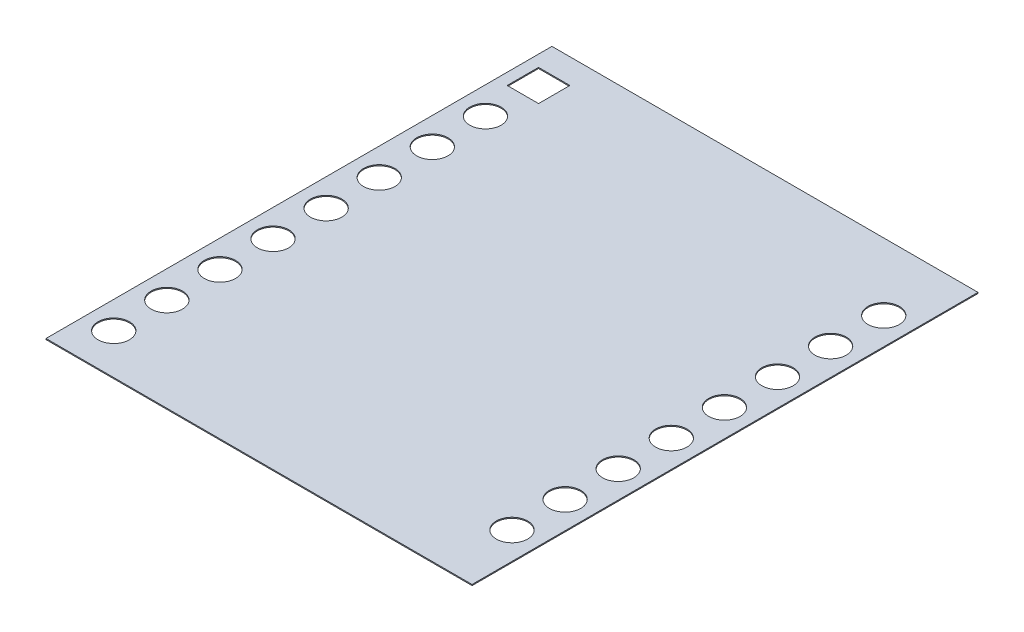
ISO-10303-21;
HEADER;
FILE_DESCRIPTION(('STEP AP214'),'2;1');
FILE_NAME('part.step','',(''),(''),'','','');
FILE_SCHEMA(('AUTOMOTIVE_DESIGN { 1 0 10303 214 1 1 1 1 }'));
ENDSEC;
DATA;
#1=APPLICATION_CONTEXT('core data for automotive mechanical design processes');
#2=APPLICATION_PROTOCOL_DEFINITION('international standard','automotive_design',2000,#1);
#3=PRODUCT_CONTEXT('',#1,'mechanical');
#4=PRODUCT('Part','Part','',(#3));
#5=PRODUCT_RELATED_PRODUCT_CATEGORY('part','',(#4));
#6=PRODUCT_DEFINITION_FORMATION('','',#4);
#7=PRODUCT_DEFINITION_CONTEXT('part definition',#1,'design');
#8=PRODUCT_DEFINITION('design','',#6,#7);
#9=PRODUCT_DEFINITION_SHAPE('','',#8);
#10=(LENGTH_UNIT() NAMED_UNIT(*) SI_UNIT(.MILLI.,.METRE.));
#11=(NAMED_UNIT(*) PLANE_ANGLE_UNIT() SI_UNIT($,.RADIAN.));
#12=(NAMED_UNIT(*) SI_UNIT($,.STERADIAN.) SOLID_ANGLE_UNIT());
#13=UNCERTAINTY_MEASURE_WITH_UNIT(LENGTH_MEASURE(1.E-05),#10,'distance_accuracy_value','');
#14=(GEOMETRIC_REPRESENTATION_CONTEXT(3) GLOBAL_UNCERTAINTY_ASSIGNED_CONTEXT((#13)) GLOBAL_UNIT_ASSIGNED_CONTEXT((#10,
#11,#12)) REPRESENTATION_CONTEXT('',''));
#15=CARTESIAN_POINT('',(0.,0.,0.));
#16=DIRECTION('',(0.,0.,1.));
#17=DIRECTION('',(1.,0.,0.));
#18=AXIS2_PLACEMENT_3D('',#15,#16,#17);
#19=CARTESIAN_POINT('',(0.,0.025,0.));
#20=DIRECTION('',(0.,1.,0.));
#21=DIRECTION('',(0.,0.,1.));
#22=AXIS2_PLACEMENT_3D('',#19,#20,#21);
#23=PLANE('',#22);
#24=CARTESIAN_POINT('',(1.3,0.025,-19.72));
#25=DIRECTION('',(0.,1.,0.));
#26=DIRECTION('',(0.,0.,1.));
#27=AXIS2_PLACEMENT_3D('',#24,#25,#26);
#28=CIRCLE('',#27,0.75);
#29=CARTESIAN_POINT('',(1.3,0.025,-18.97));
#30=VERTEX_POINT('',#29);
#31=EDGE_CURVE('E153',#30,#30,#28,.F.);
#32=ORIENTED_EDGE('',*,*,#31,.T.);
#33=EDGE_LOOP('',(#32));
#34=FACE_BOUND('',#33,.T.);
#35=CARTESIAN_POINT('',(1.3,0.025,-17.18));
#36=DIRECTION('',(0.,1.,0.));
#37=DIRECTION('',(0.,0.,1.));
#38=AXIS2_PLACEMENT_3D('',#35,#36,#37);
#39=CIRCLE('',#38,0.75);
#40=CARTESIAN_POINT('',(1.3,0.025,-16.43));
#41=VERTEX_POINT('',#40);
#42=EDGE_CURVE('E156',#41,#41,#39,.F.);
#43=ORIENTED_EDGE('',*,*,#42,.T.);
#44=EDGE_LOOP('',(#43));
#45=FACE_BOUND('',#44,.T.);
#46=CARTESIAN_POINT('',(1.3,0.025,-14.64));
#47=DIRECTION('',(0.,1.,0.));
#48=DIRECTION('',(0.,0.,1.));
#49=AXIS2_PLACEMENT_3D('',#46,#47,#48);
#50=CIRCLE('',#49,0.75);
#51=CARTESIAN_POINT('',(1.3,0.025,-13.89));
#52=VERTEX_POINT('',#51);
#53=EDGE_CURVE('E159',#52,#52,#50,.F.);
#54=ORIENTED_EDGE('',*,*,#53,.T.);
#55=EDGE_LOOP('',(#54));
#56=FACE_BOUND('',#55,.T.);
#57=CARTESIAN_POINT('',(1.3,0.025,-12.1));
#58=DIRECTION('',(0.,1.,0.));
#59=DIRECTION('',(0.,0.,1.));
#60=AXIS2_PLACEMENT_3D('',#57,#58,#59);
#61=CIRCLE('',#60,0.75);
#62=CARTESIAN_POINT('',(1.3,0.025,-11.35));
#63=VERTEX_POINT('',#62);
#64=EDGE_CURVE('E162',#63,#63,#61,.F.);
#65=ORIENTED_EDGE('',*,*,#64,.T.);
#66=EDGE_LOOP('',(#65));
#67=FACE_BOUND('',#66,.T.);
#68=CARTESIAN_POINT('',(1.3,0.025,-9.56));
#69=DIRECTION('',(0.,1.,0.));
#70=DIRECTION('',(0.,0.,1.));
#71=AXIS2_PLACEMENT_3D('',#68,#69,#70);
#72=CIRCLE('',#71,0.75);
#73=CARTESIAN_POINT('',(1.3,0.025,-8.81));
#74=VERTEX_POINT('',#73);
#75=EDGE_CURVE('E165',#74,#74,#72,.F.);
#76=ORIENTED_EDGE('',*,*,#75,.T.);
#77=EDGE_LOOP('',(#76));
#78=FACE_BOUND('',#77,.T.);
#79=CARTESIAN_POINT('',(1.3,0.025,-7.02));
#80=DIRECTION('',(0.,1.,0.));
#81=DIRECTION('',(0.,0.,1.));
#82=AXIS2_PLACEMENT_3D('',#79,#80,#81);
#83=CIRCLE('',#82,0.75);
#84=CARTESIAN_POINT('',(1.3,0.025,-6.27));
#85=VERTEX_POINT('',#84);
#86=EDGE_CURVE('E168',#85,#85,#83,.F.);
#87=ORIENTED_EDGE('',*,*,#86,.T.);
#88=EDGE_LOOP('',(#87));
#89=FACE_BOUND('',#88,.T.);
#90=CARTESIAN_POINT('',(1.3,0.025,-4.48));
#91=DIRECTION('',(0.,1.,0.));
#92=DIRECTION('',(0.,0.,1.));
#93=AXIS2_PLACEMENT_3D('',#90,#91,#92);
#94=CIRCLE('',#93,0.75);
#95=CARTESIAN_POINT('',(1.3,0.025,-3.73));
#96=VERTEX_POINT('',#95);
#97=EDGE_CURVE('E171',#96,#96,#94,.F.);
#98=ORIENTED_EDGE('',*,*,#97,.T.);
#99=EDGE_LOOP('',(#98));
#100=FACE_BOUND('',#99,.T.);
#101=CARTESIAN_POINT('',(1.3,0.025,-1.94));
#102=DIRECTION('',(0.,1.,0.));
#103=DIRECTION('',(0.,0.,1.));
#104=AXIS2_PLACEMENT_3D('',#101,#102,#103);
#105=CIRCLE('',#104,0.75);
#106=CARTESIAN_POINT('',(1.3,0.025,-1.19));
#107=VERTEX_POINT('',#106);
#108=EDGE_CURVE('E174',#107,#107,#105,.F.);
#109=ORIENTED_EDGE('',*,*,#108,.T.);
#110=EDGE_LOOP('',(#109));
#111=FACE_BOUND('',#110,.T.);
#112=CARTESIAN_POINT('',(19.08,0.025,-20.99));
#113=DIRECTION('',(0.,1.,0.));
#114=DIRECTION('',(0.,0.,1.));
#115=AXIS2_PLACEMENT_3D('',#112,#113,#114);
#116=CIRCLE('',#115,0.75);
#117=CARTESIAN_POINT('',(19.08,0.025,-20.24));
#118=VERTEX_POINT('',#117);
#119=EDGE_CURVE('E177',#118,#118,#116,.F.);
#120=ORIENTED_EDGE('',*,*,#119,.T.);
#121=EDGE_LOOP('',(#120));
#122=FACE_BOUND('',#121,.T.);
#123=CARTESIAN_POINT('',(19.08,0.025,-18.45));
#124=DIRECTION('',(0.,1.,0.));
#125=DIRECTION('',(0.,0.,1.));
#126=AXIS2_PLACEMENT_3D('',#123,#124,#125);
#127=CIRCLE('',#126,0.75);
#128=CARTESIAN_POINT('',(19.08,0.025,-17.7));
#129=VERTEX_POINT('',#128);
#130=EDGE_CURVE('E180',#129,#129,#127,.F.);
#131=ORIENTED_EDGE('',*,*,#130,.T.);
#132=EDGE_LOOP('',(#131));
#133=FACE_BOUND('',#132,.T.);
#134=CARTESIAN_POINT('',(19.08,0.025,-15.91));
#135=DIRECTION('',(0.,1.,0.));
#136=DIRECTION('',(0.,0.,1.));
#137=AXIS2_PLACEMENT_3D('',#134,#135,#136);
#138=CIRCLE('',#137,0.75);
#139=CARTESIAN_POINT('',(19.08,0.025,-15.16));
#140=VERTEX_POINT('',#139);
#141=EDGE_CURVE('E183',#140,#140,#138,.F.);
#142=ORIENTED_EDGE('',*,*,#141,.T.);
#143=EDGE_LOOP('',(#142));
#144=FACE_BOUND('',#143,.T.);
#145=CARTESIAN_POINT('',(19.08,0.025,-13.37));
#146=DIRECTION('',(0.,1.,0.));
#147=DIRECTION('',(0.,0.,1.));
#148=AXIS2_PLACEMENT_3D('',#145,#146,#147);
#149=CIRCLE('',#148,0.75);
#150=CARTESIAN_POINT('',(19.08,0.025,-12.62));
#151=VERTEX_POINT('',#150);
#152=EDGE_CURVE('E186',#151,#151,#149,.F.);
#153=ORIENTED_EDGE('',*,*,#152,.T.);
#154=EDGE_LOOP('',(#153));
#155=FACE_BOUND('',#154,.T.);
#156=CARTESIAN_POINT('',(19.08,0.025,-10.83));
#157=DIRECTION('',(0.,1.,0.));
#158=DIRECTION('',(0.,0.,1.));
#159=AXIS2_PLACEMENT_3D('',#156,#157,#158);
#160=CIRCLE('',#159,0.75);
#161=CARTESIAN_POINT('',(19.08,0.025,-10.08));
#162=VERTEX_POINT('',#161);
#163=EDGE_CURVE('E189',#162,#162,#160,.F.);
#164=ORIENTED_EDGE('',*,*,#163,.T.);
#165=EDGE_LOOP('',(#164));
#166=FACE_BOUND('',#165,.T.);
#167=CARTESIAN_POINT('',(19.08,0.025,-8.29));
#168=DIRECTION('',(0.,1.,0.));
#169=DIRECTION('',(0.,0.,1.));
#170=AXIS2_PLACEMENT_3D('',#167,#168,#169);
#171=CIRCLE('',#170,0.75);
#172=CARTESIAN_POINT('',(19.08,0.025,-7.54));
#173=VERTEX_POINT('',#172);
#174=EDGE_CURVE('E192',#173,#173,#171,.F.);
#175=ORIENTED_EDGE('',*,*,#174,.T.);
#176=EDGE_LOOP('',(#175));
#177=FACE_BOUND('',#176,.T.);
#178=CARTESIAN_POINT('',(19.08,0.025,-5.75));
#179=DIRECTION('',(0.,1.,0.));
#180=DIRECTION('',(0.,0.,1.));
#181=AXIS2_PLACEMENT_3D('',#178,#179,#180);
#182=CIRCLE('',#181,0.75);
#183=CARTESIAN_POINT('',(19.08,0.025,-5.));
#184=VERTEX_POINT('',#183);
#185=EDGE_CURVE('E194',#184,#184,#182,.F.);
#186=ORIENTED_EDGE('',*,*,#185,.T.);
#187=EDGE_LOOP('',(#186));
#188=FACE_BOUND('',#187,.T.);
#189=CARTESIAN_POINT('',(19.08,0.025,-3.21));
#190=DIRECTION('',(0.,1.,0.));
#191=DIRECTION('',(0.,0.,1.));
#192=AXIS2_PLACEMENT_3D('',#189,#190,#191);
#193=CIRCLE('',#192,0.75);
#194=CARTESIAN_POINT('',(19.08,0.025,-2.46));
#195=VERTEX_POINT('',#194);
#196=EDGE_CURVE('E20',#195,#195,#193,.F.);
#197=ORIENTED_EDGE('',*,*,#196,.T.);
#198=EDGE_LOOP('',(#197));
#199=FACE_BOUND('',#198,.T.);
#200=DIRECTION('',(1.,0.,0.));
#201=VECTOR('',#200,1.);
#202=CARTESIAN_POINT('',(0.55,0.025,-21.51));
#203=LINE('',#202,#201);
#204=CARTESIAN_POINT('',(2.05,0.025,-21.51));
#205=VERTEX_POINT('',#204);
#206=CARTESIAN_POINT('',(0.55,0.025,-21.51));
#207=VERTEX_POINT('',#206);
#208=EDGE_CURVE('E206',#205,#207,#203,.F.);
#209=ORIENTED_EDGE('',*,*,#208,.T.);
#210=DIRECTION('',(0.,0.,1.));
#211=VECTOR('',#210,1.);
#212=CARTESIAN_POINT('',(0.55,0.025,-23.01));
#213=LINE('',#212,#211);
#214=CARTESIAN_POINT('',(0.55,0.025,-23.01));
#215=VERTEX_POINT('',#214);
#216=EDGE_CURVE('E225',#207,#215,#213,.F.);
#217=ORIENTED_EDGE('',*,*,#216,.T.);
#218=DIRECTION('',(-1.,0.,0.));
#219=VECTOR('',#218,1.);
#220=CARTESIAN_POINT('',(2.05,0.025,-23.01));
#221=LINE('',#220,#219);
#222=CARTESIAN_POINT('',(2.05,0.025,-23.01));
#223=VERTEX_POINT('',#222);
#224=EDGE_CURVE('E222',#215,#223,#221,.F.);
#225=ORIENTED_EDGE('',*,*,#224,.T.);
#226=DIRECTION('',(0.,0.,-1.));
#227=VECTOR('',#226,1.);
#228=CARTESIAN_POINT('',(2.05,0.025,-21.51));
#229=LINE('',#228,#227);
#230=EDGE_CURVE('E216',#223,#205,#229,.F.);
#231=ORIENTED_EDGE('',*,*,#230,.T.);
#232=EDGE_LOOP('',(#209,#217,#225,#231));
#233=FACE_BOUND('',#232,.T.);
#234=DIRECTION('',(0.,0.,1.));
#235=VECTOR('',#234,1.);
#236=CARTESIAN_POINT('',(0.,0.025,-24.2));
#237=LINE('',#236,#235);
#238=CARTESIAN_POINT('',(0.,0.025,0.));
#239=VERTEX_POINT('',#238);
#240=CARTESIAN_POINT('',(0.,0.025,-24.2));
#241=VERTEX_POINT('',#240);
#242=EDGE_CURVE('E96',#239,#241,#237,.F.);
#243=ORIENTED_EDGE('',*,*,#242,.F.);
#244=DIRECTION('',(1.,0.,0.));
#245=VECTOR('',#244,1.);
#246=CARTESIAN_POINT('',(0.,0.025,0.));
#247=LINE('',#246,#245);
#248=CARTESIAN_POINT('',(20.38,0.025,0.));
#249=VERTEX_POINT('',#248);
#250=EDGE_CURVE('E93',#249,#239,#247,.F.);
#251=ORIENTED_EDGE('',*,*,#250,.F.);
#252=DIRECTION('',(0.,0.,-1.));
#253=VECTOR('',#252,1.);
#254=CARTESIAN_POINT('',(20.38,0.025,0.));
#255=LINE('',#254,#253);
#256=CARTESIAN_POINT('',(20.38,0.025,-24.2));
#257=VERTEX_POINT('',#256);
#258=EDGE_CURVE('E84',#257,#249,#255,.F.);
#259=ORIENTED_EDGE('',*,*,#258,.F.);
#260=DIRECTION('',(-1.,0.,0.));
#261=VECTOR('',#260,1.);
#262=CARTESIAN_POINT('',(20.38,0.025,-24.2));
#263=LINE('',#262,#261);
#264=EDGE_CURVE('E79',#241,#257,#263,.F.);
#265=ORIENTED_EDGE('',*,*,#264,.F.);
#266=EDGE_LOOP('',(#243,#251,#259,#265));
#267=FACE_BOUND('',#266,.T.);
#268=ADVANCED_FACE('F17',(#34,#45,#56,#67,#78,#89,#100,#111,#122,#133,#144,#155,#166,#177,#188,
#199,#233,#267),#23,.T.);
#269=CARTESIAN_POINT('',(0.,-0.025,0.));
#270=DIRECTION('',(0.,0.,1.));
#271=DIRECTION('',(1.,0.,0.));
#272=AXIS2_PLACEMENT_3D('',#269,#270,#271);
#273=PLANE('',#272);
#274=DIRECTION('',(0.,1.,0.));
#275=VECTOR('',#274,1.);
#276=CARTESIAN_POINT('',(0.,-0.025,0.));
#277=LINE('',#276,#275);
#278=CARTESIAN_POINT('',(0.,-0.025,0.));
#279=VERTEX_POINT('',#278);
#280=EDGE_CURVE('E231',#279,#239,#277,.T.);
#281=ORIENTED_EDGE('',*,*,#280,.F.);
#282=DIRECTION('',(1.,0.,0.));
#283=VECTOR('',#282,1.);
#284=CARTESIAN_POINT('',(0.,-0.025,0.));
#285=LINE('',#284,#283);
#286=CARTESIAN_POINT('',(20.38,-0.025,0.));
#287=VERTEX_POINT('',#286);
#288=EDGE_CURVE('E103',#279,#287,#285,.T.);
#289=ORIENTED_EDGE('',*,*,#288,.T.);
#290=DIRECTION('',(0.,1.,0.));
#291=VECTOR('',#290,1.);
#292=CARTESIAN_POINT('',(20.38,-0.025,0.));
#293=LINE('',#292,#291);
#294=EDGE_CURVE('E89',#249,#287,#293,.F.);
#295=ORIENTED_EDGE('',*,*,#294,.F.);
#296=ORIENTED_EDGE('',*,*,#250,.T.);
#297=EDGE_LOOP('',(#281,#289,#295,#296));
#298=FACE_BOUND('',#297,.T.);
#299=ADVANCED_FACE('F102',(#298),#273,.T.);
#300=CARTESIAN_POINT('',(20.38,-0.025,0.));
#301=DIRECTION('',(1.,0.,0.));
#302=DIRECTION('',(0.,0.,-1.));
#303=AXIS2_PLACEMENT_3D('',#300,#301,#302);
#304=PLANE('',#303);
#305=ORIENTED_EDGE('',*,*,#294,.T.);
#306=DIRECTION('',(0.,0.,1.));
#307=VECTOR('',#306,1.);
#308=CARTESIAN_POINT('',(20.38,-0.025,0.));
#309=LINE('',#308,#307);
#310=CARTESIAN_POINT('',(20.38,-0.025,-24.2));
#311=VERTEX_POINT('',#310);
#312=EDGE_CURVE('E239',#287,#311,#309,.F.);
#313=ORIENTED_EDGE('',*,*,#312,.T.);
#314=DIRECTION('',(0.,1.,0.));
#315=VECTOR('',#314,1.);
#316=CARTESIAN_POINT('',(20.38,-0.025,-24.2));
#317=LINE('',#316,#315);
#318=EDGE_CURVE('E91',#257,#311,#317,.F.);
#319=ORIENTED_EDGE('',*,*,#318,.F.);
#320=ORIENTED_EDGE('',*,*,#258,.T.);
#321=EDGE_LOOP('',(#305,#313,#319,#320));
#322=FACE_BOUND('',#321,.T.);
#323=ADVANCED_FACE('F86',(#322),#304,.T.);
#324=CARTESIAN_POINT('',(20.38,-0.025,-24.2));
#325=DIRECTION('',(0.,0.,-1.));
#326=DIRECTION('',(-1.,0.,0.));
#327=AXIS2_PLACEMENT_3D('',#324,#325,#326);
#328=PLANE('',#327);
#329=ORIENTED_EDGE('',*,*,#318,.T.);
#330=DIRECTION('',(1.,0.,0.));
#331=VECTOR('',#330,1.);
#332=CARTESIAN_POINT('',(0.,-0.025,-24.2));
#333=LINE('',#332,#331);
#334=CARTESIAN_POINT('',(0.,-0.025,-24.2));
#335=VERTEX_POINT('',#334);
#336=EDGE_CURVE('E235',#311,#335,#333,.F.);
#337=ORIENTED_EDGE('',*,*,#336,.T.);
#338=DIRECTION('',(0.,1.,0.));
#339=VECTOR('',#338,1.);
#340=CARTESIAN_POINT('',(0.,-0.025,-24.2));
#341=LINE('',#340,#339);
#342=EDGE_CURVE('E228',#241,#335,#341,.F.);
#343=ORIENTED_EDGE('',*,*,#342,.F.);
#344=ORIENTED_EDGE('',*,*,#264,.T.);
#345=EDGE_LOOP('',(#329,#337,#343,#344));
#346=FACE_BOUND('',#345,.T.);
#347=ADVANCED_FACE('F234',(#346),#328,.T.);
#348=CARTESIAN_POINT('',(0.,-0.025,-24.2));
#349=DIRECTION('',(-1.,0.,0.));
#350=DIRECTION('',(0.,0.,1.));
#351=AXIS2_PLACEMENT_3D('',#348,#349,#350);
#352=PLANE('',#351);
#353=ORIENTED_EDGE('',*,*,#342,.T.);
#354=DIRECTION('',(0.,0.,1.));
#355=VECTOR('',#354,1.);
#356=CARTESIAN_POINT('',(0.,-0.025,0.));
#357=LINE('',#356,#355);
#358=EDGE_CURVE('E241',#335,#279,#357,.T.);
#359=ORIENTED_EDGE('',*,*,#358,.T.);
#360=ORIENTED_EDGE('',*,*,#280,.T.);
#361=ORIENTED_EDGE('',*,*,#242,.T.);
#362=EDGE_LOOP('',(#353,#359,#360,#361));
#363=FACE_BOUND('',#362,.T.);
#364=ADVANCED_FACE('F351',(#363),#352,.T.);
#365=CARTESIAN_POINT('',(0.55,0.025,-23.01));
#366=DIRECTION('',(-1.,0.,0.));
#367=DIRECTION('',(0.,0.,1.));
#368=AXIS2_PLACEMENT_3D('',#365,#366,#367);
#369=PLANE('',#368);
#370=DIRECTION('',(0.,0.,1.));
#371=VECTOR('',#370,1.);
#372=CARTESIAN_POINT('',(0.55,-0.025,0.));
#373=LINE('',#372,#371);
#374=CARTESIAN_POINT('',(0.55,-0.025,-21.51));
#375=VERTEX_POINT('',#374);
#376=CARTESIAN_POINT('',(0.55,-0.025,-23.01));
#377=VERTEX_POINT('',#376);
#378=EDGE_CURVE('E245',#375,#377,#373,.F.);
#379=ORIENTED_EDGE('',*,*,#378,.T.);
#380=DIRECTION('',(0.,1.,0.));
#381=VECTOR('',#380,1.);
#382=CARTESIAN_POINT('',(0.55,0.025,-23.01));
#383=LINE('',#382,#381);
#384=EDGE_CURVE('E219',#377,#215,#383,.T.);
#385=ORIENTED_EDGE('',*,*,#384,.T.);
#386=ORIENTED_EDGE('',*,*,#216,.F.);
#387=DIRECTION('',(0.,1.,0.));
#388=VECTOR('',#387,1.);
#389=CARTESIAN_POINT('',(0.55,0.025,-21.51));
#390=LINE('',#389,#388);
#391=EDGE_CURVE('E201',#207,#375,#390,.F.);
#392=ORIENTED_EDGE('',*,*,#391,.T.);
#393=EDGE_LOOP('',(#379,#385,#386,#392));
#394=FACE_BOUND('',#393,.T.);
#395=ADVANCED_FACE('F262',(#394),#369,.F.);
#396=CARTESIAN_POINT('',(2.05,0.025,-23.01));
#397=DIRECTION('',(0.,0.,-1.));
#398=DIRECTION('',(-1.,0.,0.));
#399=AXIS2_PLACEMENT_3D('',#396,#397,#398);
#400=PLANE('',#399);
#401=DIRECTION('',(1.,0.,0.));
#402=VECTOR('',#401,1.);
#403=CARTESIAN_POINT('',(0.,-0.025,-23.01));
#404=LINE('',#403,#402);
#405=CARTESIAN_POINT('',(2.05,-0.025,-23.01));
#406=VERTEX_POINT('',#405);
#407=EDGE_CURVE('E248',#377,#406,#404,.T.);
#408=ORIENTED_EDGE('',*,*,#407,.T.);
#409=DIRECTION('',(0.,1.,0.));
#410=VECTOR('',#409,1.);
#411=CARTESIAN_POINT('',(2.05,0.025,-23.01));
#412=LINE('',#411,#410);
#413=EDGE_CURVE('E213',#406,#223,#412,.T.);
#414=ORIENTED_EDGE('',*,*,#413,.T.);
#415=ORIENTED_EDGE('',*,*,#224,.F.);
#416=ORIENTED_EDGE('',*,*,#384,.F.);
#417=EDGE_LOOP('',(#408,#414,#415,#416));
#418=FACE_BOUND('',#417,.T.);
#419=ADVANCED_FACE('F260',(#418),#400,.F.);
#420=CARTESIAN_POINT('',(2.05,0.025,-21.51));
#421=DIRECTION('',(1.,0.,0.));
#422=DIRECTION('',(0.,0.,-1.));
#423=AXIS2_PLACEMENT_3D('',#420,#421,#422);
#424=PLANE('',#423);
#425=DIRECTION('',(0.,0.,1.));
#426=VECTOR('',#425,1.);
#427=CARTESIAN_POINT('',(2.05,-0.025,0.));
#428=LINE('',#427,#426);
#429=CARTESIAN_POINT('',(2.05,-0.025,-21.51));
#430=VERTEX_POINT('',#429);
#431=EDGE_CURVE('E251',#406,#430,#428,.T.);
#432=ORIENTED_EDGE('',*,*,#431,.T.);
#433=DIRECTION('',(0.,1.,0.));
#434=VECTOR('',#433,1.);
#435=CARTESIAN_POINT('',(2.05,0.025,-21.51));
#436=LINE('',#435,#434);
#437=EDGE_CURVE('E35',#430,#205,#436,.T.);
#438=ORIENTED_EDGE('',*,*,#437,.T.);
#439=ORIENTED_EDGE('',*,*,#230,.F.);
#440=ORIENTED_EDGE('',*,*,#413,.F.);
#441=EDGE_LOOP('',(#432,#438,#439,#440));
#442=FACE_BOUND('',#441,.T.);
#443=ADVANCED_FACE('F258',(#442),#424,.F.);
#444=CARTESIAN_POINT('',(0.55,0.025,-21.51));
#445=DIRECTION('',(0.,0.,1.));
#446=DIRECTION('',(1.,0.,0.));
#447=AXIS2_PLACEMENT_3D('',#444,#445,#446);
#448=PLANE('',#447);
#449=DIRECTION('',(1.,0.,0.));
#450=VECTOR('',#449,1.);
#451=CARTESIAN_POINT('',(0.,-0.025,-21.51));
#452=LINE('',#451,#450);
#453=EDGE_CURVE('E152',#430,#375,#452,.F.);
#454=ORIENTED_EDGE('',*,*,#453,.T.);
#455=ORIENTED_EDGE('',*,*,#391,.F.);
#456=ORIENTED_EDGE('',*,*,#208,.F.);
#457=ORIENTED_EDGE('',*,*,#437,.F.);
#458=EDGE_LOOP('',(#454,#455,#456,#457));
#459=FACE_BOUND('',#458,.T.);
#460=ADVANCED_FACE('F254',(#459),#448,.F.);
#461=CARTESIAN_POINT('',(19.08,0.025,-3.21));
#462=DIRECTION('',(0.,1.,0.));
#463=DIRECTION('',(0.,0.,1.));
#464=AXIS2_PLACEMENT_3D('',#461,#462,#463);
#465=CYLINDRICAL_SURFACE('',#464,0.75);
#466=CARTESIAN_POINT('',(19.08,-0.025,-3.21));
#467=DIRECTION('',(0.,1.,0.));
#468=DIRECTION('',(0.,0.,1.));
#469=AXIS2_PLACEMENT_3D('',#466,#467,#468);
#470=CIRCLE('',#469,0.75);
#471=CARTESIAN_POINT('',(19.08,-0.025,-2.46));
#472=VERTEX_POINT('',#471);
#473=EDGE_CURVE('E149',#472,#472,#470,.F.);
#474=ORIENTED_EDGE('',*,*,#473,.T.);
#475=EDGE_LOOP('',(#474));
#476=FACE_BOUND('',#475,.T.);
#477=ORIENTED_EDGE('',*,*,#196,.F.);
#478=EDGE_LOOP('',(#477));
#479=FACE_BOUND('',#478,.T.);
#480=ADVANCED_FACE('F338',(#476,#479),#465,.F.);
#481=CARTESIAN_POINT('',(19.08,0.025,-5.75));
#482=DIRECTION('',(0.,1.,0.));
#483=DIRECTION('',(0.,0.,1.));
#484=AXIS2_PLACEMENT_3D('',#481,#482,#483);
#485=CYLINDRICAL_SURFACE('',#484,0.75);
#486=ORIENTED_EDGE('',*,*,#185,.F.);
#487=EDGE_LOOP('',(#486));
#488=FACE_BOUND('',#487,.T.);
#489=CARTESIAN_POINT('',(19.08,-0.025,-5.75));
#490=DIRECTION('',(0.,1.,0.));
#491=DIRECTION('',(0.,0.,1.));
#492=AXIS2_PLACEMENT_3D('',#489,#490,#491);
#493=CIRCLE('',#492,0.75);
#494=CARTESIAN_POINT('',(19.08,-0.025,-5.));
#495=VERTEX_POINT('',#494);
#496=EDGE_CURVE('E146',#495,#495,#493,.F.);
#497=ORIENTED_EDGE('',*,*,#496,.T.);
#498=EDGE_LOOP('',(#497));
#499=FACE_BOUND('',#498,.T.);
#500=ADVANCED_FACE('F334',(#488,#499),#485,.F.);
#501=CARTESIAN_POINT('',(19.08,0.025,-8.29));
#502=DIRECTION('',(0.,1.,0.));
#503=DIRECTION('',(0.,0.,1.));
#504=AXIS2_PLACEMENT_3D('',#501,#502,#503);
#505=CYLINDRICAL_SURFACE('',#504,0.75);
#506=ORIENTED_EDGE('',*,*,#174,.F.);
#507=EDGE_LOOP('',(#506));
#508=FACE_BOUND('',#507,.T.);
#509=CARTESIAN_POINT('',(19.08,-0.025,-8.29));
#510=DIRECTION('',(0.,1.,0.));
#511=DIRECTION('',(0.,0.,1.));
#512=AXIS2_PLACEMENT_3D('',#509,#510,#511);
#513=CIRCLE('',#512,0.75);
#514=CARTESIAN_POINT('',(19.08,-0.025,-7.54));
#515=VERTEX_POINT('',#514);
#516=EDGE_CURVE('E143',#515,#515,#513,.F.);
#517=ORIENTED_EDGE('',*,*,#516,.T.);
#518=EDGE_LOOP('',(#517));
#519=FACE_BOUND('',#518,.T.);
#520=ADVANCED_FACE('F330',(#508,#519),#505,.F.);
#521=CARTESIAN_POINT('',(19.08,0.025,-10.83));
#522=DIRECTION('',(0.,1.,0.));
#523=DIRECTION('',(0.,0.,1.));
#524=AXIS2_PLACEMENT_3D('',#521,#522,#523);
#525=CYLINDRICAL_SURFACE('',#524,0.75);
#526=ORIENTED_EDGE('',*,*,#163,.F.);
#527=EDGE_LOOP('',(#526));
#528=FACE_BOUND('',#527,.T.);
#529=CARTESIAN_POINT('',(19.08,-0.025,-10.83));
#530=DIRECTION('',(0.,1.,0.));
#531=DIRECTION('',(0.,0.,1.));
#532=AXIS2_PLACEMENT_3D('',#529,#530,#531);
#533=CIRCLE('',#532,0.75);
#534=CARTESIAN_POINT('',(19.08,-0.025,-10.08));
#535=VERTEX_POINT('',#534);
#536=EDGE_CURVE('E140',#535,#535,#533,.F.);
#537=ORIENTED_EDGE('',*,*,#536,.T.);
#538=EDGE_LOOP('',(#537));
#539=FACE_BOUND('',#538,.T.);
#540=ADVANCED_FACE('F326',(#528,#539),#525,.F.);
#541=CARTESIAN_POINT('',(19.08,0.025,-13.37));
#542=DIRECTION('',(0.,1.,0.));
#543=DIRECTION('',(0.,0.,1.));
#544=AXIS2_PLACEMENT_3D('',#541,#542,#543);
#545=CYLINDRICAL_SURFACE('',#544,0.75);
#546=ORIENTED_EDGE('',*,*,#152,.F.);
#547=EDGE_LOOP('',(#546));
#548=FACE_BOUND('',#547,.T.);
#549=CARTESIAN_POINT('',(19.08,-0.025,-13.37));
#550=DIRECTION('',(0.,1.,0.));
#551=DIRECTION('',(0.,0.,1.));
#552=AXIS2_PLACEMENT_3D('',#549,#550,#551);
#553=CIRCLE('',#552,0.75);
#554=CARTESIAN_POINT('',(19.08,-0.025,-12.62));
#555=VERTEX_POINT('',#554);
#556=EDGE_CURVE('E137',#555,#555,#553,.F.);
#557=ORIENTED_EDGE('',*,*,#556,.T.);
#558=EDGE_LOOP('',(#557));
#559=FACE_BOUND('',#558,.T.);
#560=ADVANCED_FACE('F322',(#548,#559),#545,.F.);
#561=CARTESIAN_POINT('',(19.08,0.025,-15.91));
#562=DIRECTION('',(0.,1.,0.));
#563=DIRECTION('',(0.,0.,1.));
#564=AXIS2_PLACEMENT_3D('',#561,#562,#563);
#565=CYLINDRICAL_SURFACE('',#564,0.75);
#566=ORIENTED_EDGE('',*,*,#141,.F.);
#567=EDGE_LOOP('',(#566));
#568=FACE_BOUND('',#567,.T.);
#569=CARTESIAN_POINT('',(19.08,-0.025,-15.91));
#570=DIRECTION('',(0.,1.,0.));
#571=DIRECTION('',(0.,0.,1.));
#572=AXIS2_PLACEMENT_3D('',#569,#570,#571);
#573=CIRCLE('',#572,0.75);
#574=CARTESIAN_POINT('',(19.08,-0.025,-15.16));
#575=VERTEX_POINT('',#574);
#576=EDGE_CURVE('E134',#575,#575,#573,.F.);
#577=ORIENTED_EDGE('',*,*,#576,.T.);
#578=EDGE_LOOP('',(#577));
#579=FACE_BOUND('',#578,.T.);
#580=ADVANCED_FACE('F318',(#568,#579),#565,.F.);
#581=CARTESIAN_POINT('',(19.08,0.025,-18.45));
#582=DIRECTION('',(0.,1.,0.));
#583=DIRECTION('',(0.,0.,1.));
#584=AXIS2_PLACEMENT_3D('',#581,#582,#583);
#585=CYLINDRICAL_SURFACE('',#584,0.75);
#586=ORIENTED_EDGE('',*,*,#130,.F.);
#587=EDGE_LOOP('',(#586));
#588=FACE_BOUND('',#587,.T.);
#589=CARTESIAN_POINT('',(19.08,-0.025,-18.45));
#590=DIRECTION('',(0.,1.,0.));
#591=DIRECTION('',(0.,0.,1.));
#592=AXIS2_PLACEMENT_3D('',#589,#590,#591);
#593=CIRCLE('',#592,0.75);
#594=CARTESIAN_POINT('',(19.08,-0.025,-17.7));
#595=VERTEX_POINT('',#594);
#596=EDGE_CURVE('E131',#595,#595,#593,.F.);
#597=ORIENTED_EDGE('',*,*,#596,.T.);
#598=EDGE_LOOP('',(#597));
#599=FACE_BOUND('',#598,.T.);
#600=ADVANCED_FACE('F314',(#588,#599),#585,.F.);
#601=CARTESIAN_POINT('',(19.08,0.025,-20.99));
#602=DIRECTION('',(0.,1.,0.));
#603=DIRECTION('',(0.,0.,1.));
#604=AXIS2_PLACEMENT_3D('',#601,#602,#603);
#605=CYLINDRICAL_SURFACE('',#604,0.75);
#606=ORIENTED_EDGE('',*,*,#119,.F.);
#607=EDGE_LOOP('',(#606));
#608=FACE_BOUND('',#607,.T.);
#609=CARTESIAN_POINT('',(19.08,-0.025,-20.99));
#610=DIRECTION('',(0.,1.,0.));
#611=DIRECTION('',(0.,0.,1.));
#612=AXIS2_PLACEMENT_3D('',#609,#610,#611);
#613=CIRCLE('',#612,0.75);
#614=CARTESIAN_POINT('',(19.08,-0.025,-20.24));
#615=VERTEX_POINT('',#614);
#616=EDGE_CURVE('E128',#615,#615,#613,.F.);
#617=ORIENTED_EDGE('',*,*,#616,.T.);
#618=EDGE_LOOP('',(#617));
#619=FACE_BOUND('',#618,.T.);
#620=ADVANCED_FACE('F310',(#608,#619),#605,.F.);
#621=CARTESIAN_POINT('',(1.3,0.025,-1.94));
#622=DIRECTION('',(0.,1.,0.));
#623=DIRECTION('',(0.,0.,1.));
#624=AXIS2_PLACEMENT_3D('',#621,#622,#623);
#625=CYLINDRICAL_SURFACE('',#624,0.75);
#626=CARTESIAN_POINT('',(1.3,-0.025,-1.94));
#627=DIRECTION('',(0.,1.,0.));
#628=DIRECTION('',(0.,0.,1.));
#629=AXIS2_PLACEMENT_3D('',#626,#627,#628);
#630=CIRCLE('',#629,0.75);
#631=CARTESIAN_POINT('',(1.3,-0.025,-1.19));
#632=VERTEX_POINT('',#631);
#633=EDGE_CURVE('E125',#632,#632,#630,.F.);
#634=ORIENTED_EDGE('',*,*,#633,.T.);
#635=EDGE_LOOP('',(#634));
#636=FACE_BOUND('',#635,.T.);
#637=ORIENTED_EDGE('',*,*,#108,.F.);
#638=EDGE_LOOP('',(#637));
#639=FACE_BOUND('',#638,.T.);
#640=ADVANCED_FACE('F306',(#636,#639),#625,.F.);
#641=CARTESIAN_POINT('',(1.3,0.025,-4.48));
#642=DIRECTION('',(0.,1.,0.));
#643=DIRECTION('',(0.,0.,1.));
#644=AXIS2_PLACEMENT_3D('',#641,#642,#643);
#645=CYLINDRICAL_SURFACE('',#644,0.75);
#646=ORIENTED_EDGE('',*,*,#97,.F.);
#647=EDGE_LOOP('',(#646));
#648=FACE_BOUND('',#647,.T.);
#649=CARTESIAN_POINT('',(1.3,-0.025,-4.48));
#650=DIRECTION('',(0.,1.,0.));
#651=DIRECTION('',(0.,0.,1.));
#652=AXIS2_PLACEMENT_3D('',#649,#650,#651);
#653=CIRCLE('',#652,0.75);
#654=CARTESIAN_POINT('',(1.3,-0.025,-3.73));
#655=VERTEX_POINT('',#654);
#656=EDGE_CURVE('E122',#655,#655,#653,.F.);
#657=ORIENTED_EDGE('',*,*,#656,.T.);
#658=EDGE_LOOP('',(#657));
#659=FACE_BOUND('',#658,.T.);
#660=ADVANCED_FACE('F302',(#648,#659),#645,.F.);
#661=CARTESIAN_POINT('',(1.3,0.025,-7.02));
#662=DIRECTION('',(0.,1.,0.));
#663=DIRECTION('',(0.,0.,1.));
#664=AXIS2_PLACEMENT_3D('',#661,#662,#663);
#665=CYLINDRICAL_SURFACE('',#664,0.75);
#666=ORIENTED_EDGE('',*,*,#86,.F.);
#667=EDGE_LOOP('',(#666));
#668=FACE_BOUND('',#667,.T.);
#669=CARTESIAN_POINT('',(1.3,-0.025,-7.02));
#670=DIRECTION('',(0.,1.,0.));
#671=DIRECTION('',(0.,0.,1.));
#672=AXIS2_PLACEMENT_3D('',#669,#670,#671);
#673=CIRCLE('',#672,0.75);
#674=CARTESIAN_POINT('',(1.3,-0.025,-6.27));
#675=VERTEX_POINT('',#674);
#676=EDGE_CURVE('E119',#675,#675,#673,.F.);
#677=ORIENTED_EDGE('',*,*,#676,.T.);
#678=EDGE_LOOP('',(#677));
#679=FACE_BOUND('',#678,.T.);
#680=ADVANCED_FACE('F298',(#668,#679),#665,.F.);
#681=CARTESIAN_POINT('',(1.3,0.025,-9.56));
#682=DIRECTION('',(0.,1.,0.));
#683=DIRECTION('',(0.,0.,1.));
#684=AXIS2_PLACEMENT_3D('',#681,#682,#683);
#685=CYLINDRICAL_SURFACE('',#684,0.75);
#686=ORIENTED_EDGE('',*,*,#75,.F.);
#687=EDGE_LOOP('',(#686));
#688=FACE_BOUND('',#687,.T.);
#689=CARTESIAN_POINT('',(1.3,-0.025,-9.56));
#690=DIRECTION('',(0.,1.,0.));
#691=DIRECTION('',(0.,0.,1.));
#692=AXIS2_PLACEMENT_3D('',#689,#690,#691);
#693=CIRCLE('',#692,0.75);
#694=CARTESIAN_POINT('',(1.3,-0.025,-8.81));
#695=VERTEX_POINT('',#694);
#696=EDGE_CURVE('E116',#695,#695,#693,.F.);
#697=ORIENTED_EDGE('',*,*,#696,.T.);
#698=EDGE_LOOP('',(#697));
#699=FACE_BOUND('',#698,.T.);
#700=ADVANCED_FACE('F294',(#688,#699),#685,.F.);
#701=CARTESIAN_POINT('',(1.3,0.025,-12.1));
#702=DIRECTION('',(0.,1.,0.));
#703=DIRECTION('',(0.,0.,1.));
#704=AXIS2_PLACEMENT_3D('',#701,#702,#703);
#705=CYLINDRICAL_SURFACE('',#704,0.75);
#706=ORIENTED_EDGE('',*,*,#64,.F.);
#707=EDGE_LOOP('',(#706));
#708=FACE_BOUND('',#707,.T.);
#709=CARTESIAN_POINT('',(1.3,-0.025,-12.1));
#710=DIRECTION('',(0.,1.,0.));
#711=DIRECTION('',(0.,0.,1.));
#712=AXIS2_PLACEMENT_3D('',#709,#710,#711);
#713=CIRCLE('',#712,0.75);
#714=CARTESIAN_POINT('',(1.3,-0.025,-11.35));
#715=VERTEX_POINT('',#714);
#716=EDGE_CURVE('E113',#715,#715,#713,.F.);
#717=ORIENTED_EDGE('',*,*,#716,.T.);
#718=EDGE_LOOP('',(#717));
#719=FACE_BOUND('',#718,.T.);
#720=ADVANCED_FACE('F290',(#708,#719),#705,.F.);
#721=CARTESIAN_POINT('',(1.3,0.025,-14.64));
#722=DIRECTION('',(0.,1.,0.));
#723=DIRECTION('',(0.,0.,1.));
#724=AXIS2_PLACEMENT_3D('',#721,#722,#723);
#725=CYLINDRICAL_SURFACE('',#724,0.75);
#726=ORIENTED_EDGE('',*,*,#53,.F.);
#727=EDGE_LOOP('',(#726));
#728=FACE_BOUND('',#727,.T.);
#729=CARTESIAN_POINT('',(1.3,-0.025,-14.64));
#730=DIRECTION('',(0.,1.,0.));
#731=DIRECTION('',(0.,0.,1.));
#732=AXIS2_PLACEMENT_3D('',#729,#730,#731);
#733=CIRCLE('',#732,0.75);
#734=CARTESIAN_POINT('',(1.3,-0.025,-13.89));
#735=VERTEX_POINT('',#734);
#736=EDGE_CURVE('E110',#735,#735,#733,.F.);
#737=ORIENTED_EDGE('',*,*,#736,.T.);
#738=EDGE_LOOP('',(#737));
#739=FACE_BOUND('',#738,.T.);
#740=ADVANCED_FACE('F286',(#728,#739),#725,.F.);
#741=CARTESIAN_POINT('',(1.3,0.025,-17.18));
#742=DIRECTION('',(0.,1.,0.));
#743=DIRECTION('',(0.,0.,1.));
#744=AXIS2_PLACEMENT_3D('',#741,#742,#743);
#745=CYLINDRICAL_SURFACE('',#744,0.75);
#746=ORIENTED_EDGE('',*,*,#42,.F.);
#747=EDGE_LOOP('',(#746));
#748=FACE_BOUND('',#747,.T.);
#749=CARTESIAN_POINT('',(1.3,-0.025,-17.18));
#750=DIRECTION('',(0.,1.,0.));
#751=DIRECTION('',(0.,0.,1.));
#752=AXIS2_PLACEMENT_3D('',#749,#750,#751);
#753=CIRCLE('',#752,0.75);
#754=CARTESIAN_POINT('',(1.3,-0.025,-16.43));
#755=VERTEX_POINT('',#754);
#756=EDGE_CURVE('E26',#755,#755,#753,.F.);
#757=ORIENTED_EDGE('',*,*,#756,.T.);
#758=EDGE_LOOP('',(#757));
#759=FACE_BOUND('',#758,.T.);
#760=ADVANCED_FACE('F278',(#748,#759),#745,.F.);
#761=CARTESIAN_POINT('',(1.3,0.025,-19.72));
#762=DIRECTION('',(0.,1.,0.));
#763=DIRECTION('',(0.,0.,1.));
#764=AXIS2_PLACEMENT_3D('',#761,#762,#763);
#765=CYLINDRICAL_SURFACE('',#764,0.75);
#766=ORIENTED_EDGE('',*,*,#31,.F.);
#767=EDGE_LOOP('',(#766));
#768=FACE_BOUND('',#767,.T.);
#769=CARTESIAN_POINT('',(1.3,-0.025,-19.72));
#770=DIRECTION('',(0.,1.,0.));
#771=DIRECTION('',(0.,0.,1.));
#772=AXIS2_PLACEMENT_3D('',#769,#770,#771);
#773=CIRCLE('',#772,0.75);
#774=CARTESIAN_POINT('',(1.3,-0.025,-18.97));
#775=VERTEX_POINT('',#774);
#776=EDGE_CURVE('E11',#775,#775,#773,.F.);
#777=ORIENTED_EDGE('',*,*,#776,.T.);
#778=EDGE_LOOP('',(#777));
#779=FACE_BOUND('',#778,.T.);
#780=ADVANCED_FACE('F272',(#768,#779),#765,.F.);
#781=CARTESIAN_POINT('',(0.,-0.025,0.));
#782=DIRECTION('',(0.,1.,0.));
#783=DIRECTION('',(0.,0.,1.));
#784=AXIS2_PLACEMENT_3D('',#781,#782,#783);
#785=PLANE('',#784);
#786=ORIENTED_EDGE('',*,*,#776,.F.);
#787=EDGE_LOOP('',(#786));
#788=FACE_BOUND('',#787,.T.);
#789=ORIENTED_EDGE('',*,*,#756,.F.);
#790=EDGE_LOOP('',(#789));
#791=FACE_BOUND('',#790,.T.);
#792=ORIENTED_EDGE('',*,*,#736,.F.);
#793=EDGE_LOOP('',(#792));
#794=FACE_BOUND('',#793,.T.);
#795=ORIENTED_EDGE('',*,*,#716,.F.);
#796=EDGE_LOOP('',(#795));
#797=FACE_BOUND('',#796,.T.);
#798=ORIENTED_EDGE('',*,*,#696,.F.);
#799=EDGE_LOOP('',(#798));
#800=FACE_BOUND('',#799,.T.);
#801=ORIENTED_EDGE('',*,*,#676,.F.);
#802=EDGE_LOOP('',(#801));
#803=FACE_BOUND('',#802,.T.);
#804=ORIENTED_EDGE('',*,*,#656,.F.);
#805=EDGE_LOOP('',(#804));
#806=FACE_BOUND('',#805,.T.);
#807=ORIENTED_EDGE('',*,*,#633,.F.);
#808=EDGE_LOOP('',(#807));
#809=FACE_BOUND('',#808,.T.);
#810=ORIENTED_EDGE('',*,*,#616,.F.);
#811=EDGE_LOOP('',(#810));
#812=FACE_BOUND('',#811,.T.);
#813=ORIENTED_EDGE('',*,*,#596,.F.);
#814=EDGE_LOOP('',(#813));
#815=FACE_BOUND('',#814,.T.);
#816=ORIENTED_EDGE('',*,*,#576,.F.);
#817=EDGE_LOOP('',(#816));
#818=FACE_BOUND('',#817,.T.);
#819=ORIENTED_EDGE('',*,*,#556,.F.);
#820=EDGE_LOOP('',(#819));
#821=FACE_BOUND('',#820,.T.);
#822=ORIENTED_EDGE('',*,*,#536,.F.);
#823=EDGE_LOOP('',(#822));
#824=FACE_BOUND('',#823,.T.);
#825=ORIENTED_EDGE('',*,*,#516,.F.);
#826=EDGE_LOOP('',(#825));
#827=FACE_BOUND('',#826,.T.);
#828=ORIENTED_EDGE('',*,*,#496,.F.);
#829=EDGE_LOOP('',(#828));
#830=FACE_BOUND('',#829,.T.);
#831=ORIENTED_EDGE('',*,*,#473,.F.);
#832=EDGE_LOOP('',(#831));
#833=FACE_BOUND('',#832,.T.);
#834=ORIENTED_EDGE('',*,*,#431,.F.);
#835=ORIENTED_EDGE('',*,*,#407,.F.);
#836=ORIENTED_EDGE('',*,*,#378,.F.);
#837=ORIENTED_EDGE('',*,*,#453,.F.);
#838=EDGE_LOOP('',(#834,#835,#836,#837));
#839=FACE_BOUND('',#838,.T.);
#840=ORIENTED_EDGE('',*,*,#336,.F.);
#841=ORIENTED_EDGE('',*,*,#312,.F.);
#842=ORIENTED_EDGE('',*,*,#288,.F.);
#843=ORIENTED_EDGE('',*,*,#358,.F.);
#844=EDGE_LOOP('',(#840,#841,#842,#843));
#845=FACE_BOUND('',#844,.T.);
#846=ADVANCED_FACE('F238',(#788,#791,#794,#797,#800,#803,#806,#809,#812,#815,#818,#821,#824,
#827,#830,#833,#839,#845),#785,.F.);
#847=CLOSED_SHELL('',(#268,#299,#323,#347,#364,#395,#419,#443,#460,#480,#500,#520,#540,#560,
#580,#600,#620,#640,#660,#680,#700,#720,#740,#760,#780,#846));
#848=MANIFOLD_SOLID_BREP('B1',#847);
#849=ADVANCED_BREP_SHAPE_REPRESENTATION('',(#18,#848),#14);
#850=SHAPE_DEFINITION_REPRESENTATION(#9,#849);
ENDSEC;
END-ISO-10303-21;
